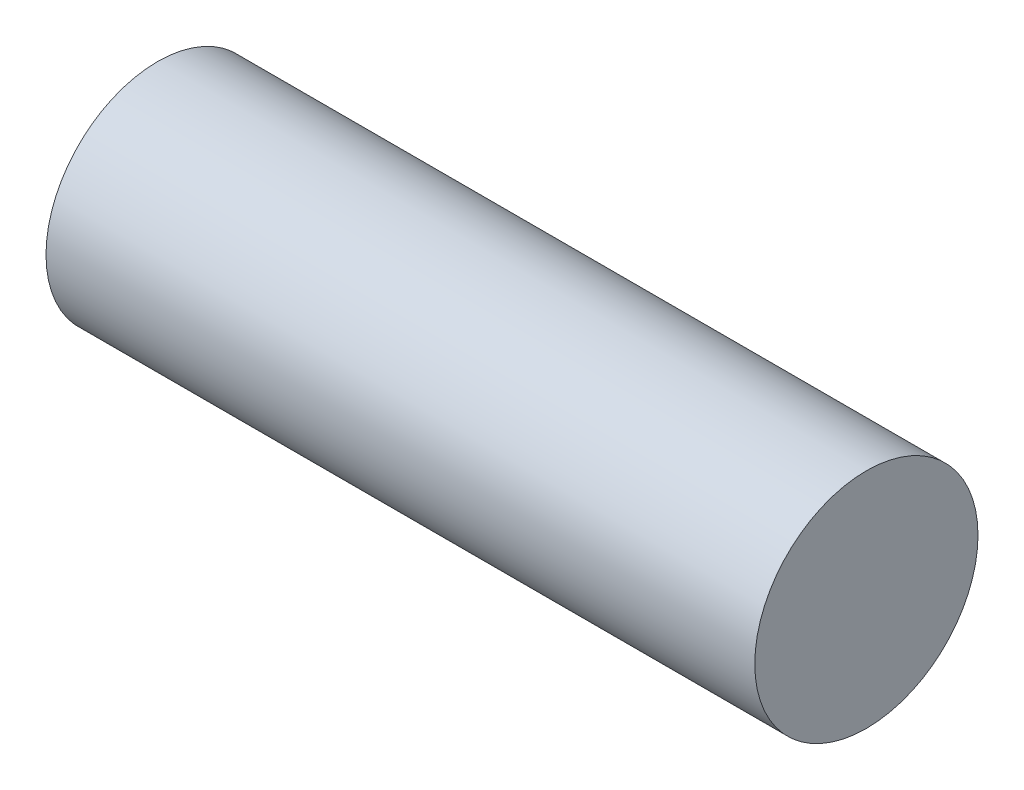
ISO-10303-21;
HEADER;
FILE_DESCRIPTION(('STEP AP214'),'2;1');
FILE_NAME('part.step','',(''),(''),'','','');
FILE_SCHEMA(('AUTOMOTIVE_DESIGN { 1 0 10303 214 1 1 1 1 }'));
ENDSEC;
DATA;
#1=APPLICATION_CONTEXT('core data for automotive mechanical design processes');
#2=APPLICATION_PROTOCOL_DEFINITION('international standard','automotive_design',2000,#1);
#3=PRODUCT_CONTEXT('',#1,'mechanical');
#4=PRODUCT('Part','Part','',(#3));
#5=PRODUCT_RELATED_PRODUCT_CATEGORY('part','',(#4));
#6=PRODUCT_DEFINITION_FORMATION('','',#4);
#7=PRODUCT_DEFINITION_CONTEXT('part definition',#1,'design');
#8=PRODUCT_DEFINITION('design','',#6,#7);
#9=PRODUCT_DEFINITION_SHAPE('','',#8);
#10=(LENGTH_UNIT() NAMED_UNIT(*) SI_UNIT(.MILLI.,.METRE.));
#11=(NAMED_UNIT(*) PLANE_ANGLE_UNIT() SI_UNIT($,.RADIAN.));
#12=(NAMED_UNIT(*) SI_UNIT($,.STERADIAN.) SOLID_ANGLE_UNIT());
#13=UNCERTAINTY_MEASURE_WITH_UNIT(LENGTH_MEASURE(1.E-05),#10,'distance_accuracy_value','');
#14=(GEOMETRIC_REPRESENTATION_CONTEXT(3) GLOBAL_UNCERTAINTY_ASSIGNED_CONTEXT((#13)) GLOBAL_UNIT_ASSIGNED_CONTEXT((#10,
#11,#12)) REPRESENTATION_CONTEXT('',''));
#15=CARTESIAN_POINT('',(0.,0.,0.));
#16=DIRECTION('',(0.,0.,1.));
#17=DIRECTION('',(1.,0.,0.));
#18=AXIS2_PLACEMENT_3D('',#15,#16,#17);
#19=CARTESIAN_POINT('',(-312.233731260098,838.326992792238,28.5022118272307));
#20=DIRECTION('',(1.,0.,0.));
#21=DIRECTION('',(0.,1.,0.));
#22=AXIS2_PLACEMENT_3D('',#19,#20,#21);
#23=PLANE('',#22);
#24=CARTESIAN_POINT('',(-312.233731260098,838.326992792238,28.5022118272307));
#25=DIRECTION('',(1.,0.,0.));
#26=DIRECTION('',(0.,0.,-1.));
#27=AXIS2_PLACEMENT_3D('',#24,#25,#26);
#28=CIRCLE('',#27,12.7);
#29=CARTESIAN_POINT('',(-312.233731260098,838.326992792238,15.8022118272307));
#30=VERTEX_POINT('',#29);
#31=EDGE_CURVE('E17',#30,#30,#28,.F.);
#32=ORIENTED_EDGE('',*,*,#31,.F.);
#33=EDGE_LOOP('',(#32));
#34=FACE_BOUND('',#33,.T.);
#35=ADVANCED_FACE('F14',(#34),#23,.T.);
#36=CARTESIAN_POINT('',(-392.883075317495,838.326992792238,28.5022118272307));
#37=DIRECTION('',(1.,0.,0.));
#38=DIRECTION('',(0.,1.,0.));
#39=AXIS2_PLACEMENT_3D('',#36,#37,#38);
#40=PLANE('',#39);
#41=CARTESIAN_POINT('',(-392.883075317495,838.326992792238,28.5022118272307));
#42=DIRECTION('',(1.,0.,0.));
#43=DIRECTION('',(0.,0.,-1.));
#44=AXIS2_PLACEMENT_3D('',#41,#42,#43);
#45=CIRCLE('',#44,12.7);
#46=CARTESIAN_POINT('',(-392.883075317495,838.326992792238,15.8022118272307));
#47=VERTEX_POINT('',#46);
#48=EDGE_CURVE('E9',#47,#47,#45,.T.);
#49=ORIENTED_EDGE('',*,*,#48,.F.);
#50=EDGE_LOOP('',(#49));
#51=FACE_BOUND('',#50,.T.);
#52=ADVANCED_FACE('F29',(#51),#40,.F.);
#53=CARTESIAN_POINT('',(-329.657707612948,838.326992792238,28.5022118272307));
#54=DIRECTION('',(1.,0.,0.));
#55=DIRECTION('',(0.,0.,-1.));
#56=AXIS2_PLACEMENT_3D('',#53,#54,#55);
#57=CYLINDRICAL_SURFACE('',#56,12.7);
#58=ORIENTED_EDGE('',*,*,#31,.T.);
#59=EDGE_LOOP('',(#58));
#60=FACE_BOUND('',#59,.T.);
#61=ORIENTED_EDGE('',*,*,#48,.T.);
#62=EDGE_LOOP('',(#61));
#63=FACE_BOUND('',#62,.T.);
#64=ADVANCED_FACE('F26',(#60,#63),#57,.T.);
#65=CLOSED_SHELL('',(#35,#52,#64));
#66=MANIFOLD_SOLID_BREP('B1',#65);
#67=ADVANCED_BREP_SHAPE_REPRESENTATION('',(#18,#66),#14);
#68=SHAPE_DEFINITION_REPRESENTATION(#9,#67);
ENDSEC;
END-ISO-10303-21;
